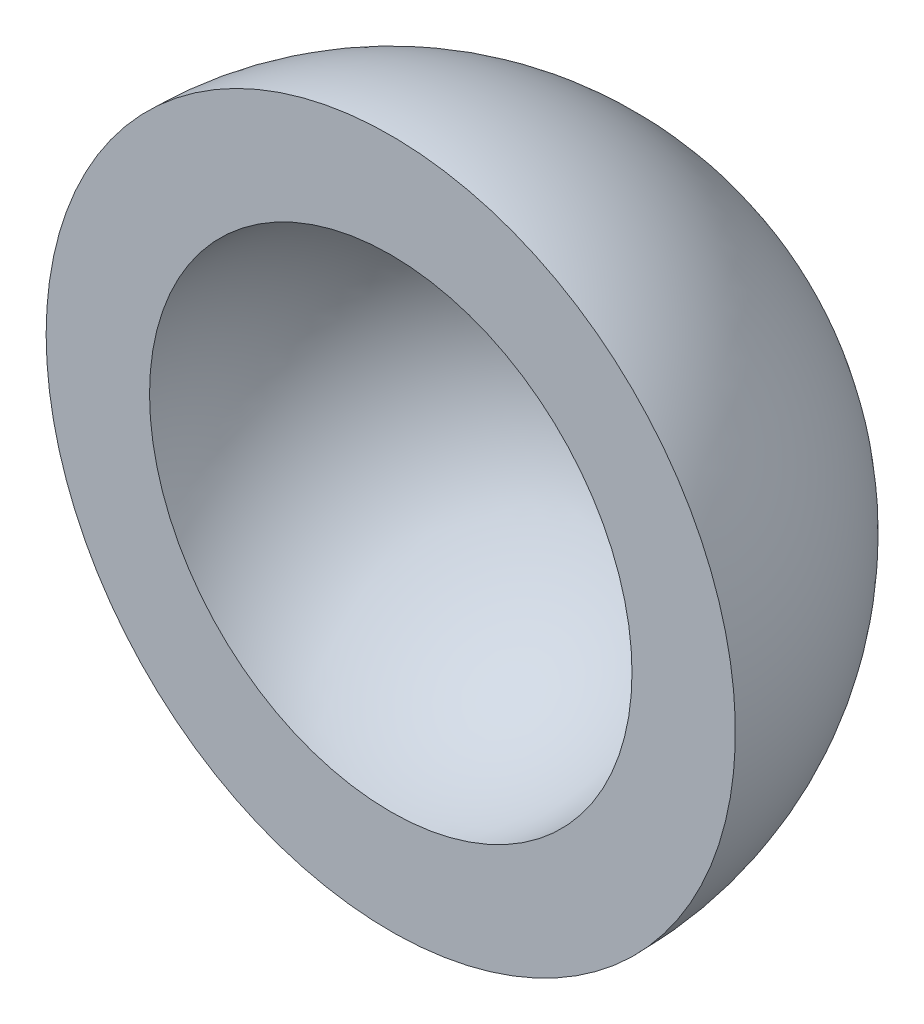
ISO-10303-21;
HEADER;
FILE_DESCRIPTION(('STEP AP214'),'2;1');
FILE_NAME('part.step','',(''),(''),'','','');
FILE_SCHEMA(('AUTOMOTIVE_DESIGN { 1 0 10303 214 1 1 1 1 }'));
ENDSEC;
DATA;
#1=APPLICATION_CONTEXT('core data for automotive mechanical design processes');
#2=APPLICATION_PROTOCOL_DEFINITION('international standard','automotive_design',2000,#1);
#3=PRODUCT_CONTEXT('',#1,'mechanical');
#4=PRODUCT('Part','Part','',(#3));
#5=PRODUCT_RELATED_PRODUCT_CATEGORY('part','',(#4));
#6=PRODUCT_DEFINITION_FORMATION('','',#4);
#7=PRODUCT_DEFINITION_CONTEXT('part definition',#1,'design');
#8=PRODUCT_DEFINITION('design','',#6,#7);
#9=PRODUCT_DEFINITION_SHAPE('','',#8);
#10=(LENGTH_UNIT() NAMED_UNIT(*) SI_UNIT(.MILLI.,.METRE.));
#11=(NAMED_UNIT(*) PLANE_ANGLE_UNIT() SI_UNIT($,.RADIAN.));
#12=(NAMED_UNIT(*) SI_UNIT($,.STERADIAN.) SOLID_ANGLE_UNIT());
#13=UNCERTAINTY_MEASURE_WITH_UNIT(LENGTH_MEASURE(1.E-05),#10,'distance_accuracy_value','');
#14=(GEOMETRIC_REPRESENTATION_CONTEXT(3) GLOBAL_UNCERTAINTY_ASSIGNED_CONTEXT((#13)) GLOBAL_UNIT_ASSIGNED_CONTEXT((#10,
#11,#12)) REPRESENTATION_CONTEXT('',''));
#15=CARTESIAN_POINT('',(0.,0.,0.));
#16=DIRECTION('',(0.,0.,1.));
#17=DIRECTION('',(1.,0.,0.));
#18=AXIS2_PLACEMENT_3D('',#15,#16,#17);
#19=CARTESIAN_POINT('',(0.,0.,0.));
#20=DIRECTION('',(0.,1.,0.));
#21=DIRECTION('',(-1.,0.,0.));
#22=AXIS2_PLACEMENT_3D('',#19,#20,#21);
#23=SPHERICAL_SURFACE('',#22,70.);
#24=CARTESIAN_POINT('',(0.,0.,0.));
#25=DIRECTION('',(0.,0.,-1.));
#26=DIRECTION('',(-1.,0.,0.));
#27=AXIS2_PLACEMENT_3D('',#24,#25,#26);
#28=SPHERICAL_SURFACE('',#27,70.);
#29=CARTESIAN_POINT('',(0.,0.,0.));
#30=DIRECTION('',(0.,0.,-1.));
#31=DIRECTION('',(-1.,0.,0.));
#32=AXIS2_PLACEMENT_3D('',#29,#30,#31);
#33=CIRCLE('',#32,70.);
#34=CARTESIAN_POINT('',(-70.,0.,-4.88807387438039E-13));
#35=VERTEX_POINT('',#34);
#36=EDGE_CURVE('E40',#35,#35,#33,.T.);
#37=ORIENTED_EDGE('',*,*,#36,.F.);
#38=EDGE_LOOP('',(#37));
#39=FACE_BOUND('',#38,.T.);
#40=ADVANCED_FACE('F33',(#39),#28,.F.);
#41=CARTESIAN_POINT('',(0.,0.,0.));
#42=DIRECTION('',(0.,1.,0.));
#43=DIRECTION('',(-1.,0.,0.));
#44=AXIS2_PLACEMENT_3D('',#41,#42,#43);
#45=SPHERICAL_SURFACE('',#44,100.);
#46=CARTESIAN_POINT('',(0.,0.,0.));
#47=DIRECTION('',(0.,0.,-1.));
#48=DIRECTION('',(-1.,0.,0.));
#49=AXIS2_PLACEMENT_3D('',#46,#47,#48);
#50=SPHERICAL_SURFACE('',#49,100.);
#51=CARTESIAN_POINT('',(0.,0.,0.));
#52=DIRECTION('',(0.,0.,-1.));
#53=DIRECTION('',(-1.,0.,0.));
#54=AXIS2_PLACEMENT_3D('',#51,#52,#53);
#55=CIRCLE('',#54,100.);
#56=CARTESIAN_POINT('',(-100.,0.,-6.98296267768627E-13));
#57=VERTEX_POINT('',#56);
#58=EDGE_CURVE('E10',#57,#57,#55,.T.);
#59=ORIENTED_EDGE('',*,*,#58,.T.);
#60=EDGE_LOOP('',(#59));
#61=FACE_BOUND('',#60,.T.);
#62=ADVANCED_FACE('F35',(#61),#50,.T.);
#63=CARTESIAN_POINT('',(0.,0.,0.));
#64=DIRECTION('',(0.,0.,-1.));
#65=DIRECTION('',(-1.,0.,0.));
#66=AXIS2_PLACEMENT_3D('',#63,#64,#65);
#67=PLANE('',#66);
#68=ORIENTED_EDGE('',*,*,#36,.T.);
#69=EDGE_LOOP('',(#68));
#70=FACE_BOUND('',#69,.T.);
#71=ORIENTED_EDGE('',*,*,#58,.F.);
#72=EDGE_LOOP('',(#71));
#73=FACE_BOUND('',#72,.T.);
#74=ADVANCED_FACE('F46',(#70,#73),#67,.F.);
#75=CLOSED_SHELL('',(#40,#62,#74));
#76=MANIFOLD_SOLID_BREP('B2',#75);
#77=ADVANCED_BREP_SHAPE_REPRESENTATION('',(#18,#76),#14);
#78=SHAPE_DEFINITION_REPRESENTATION(#9,#77);
ENDSEC;
END-ISO-10303-21;
